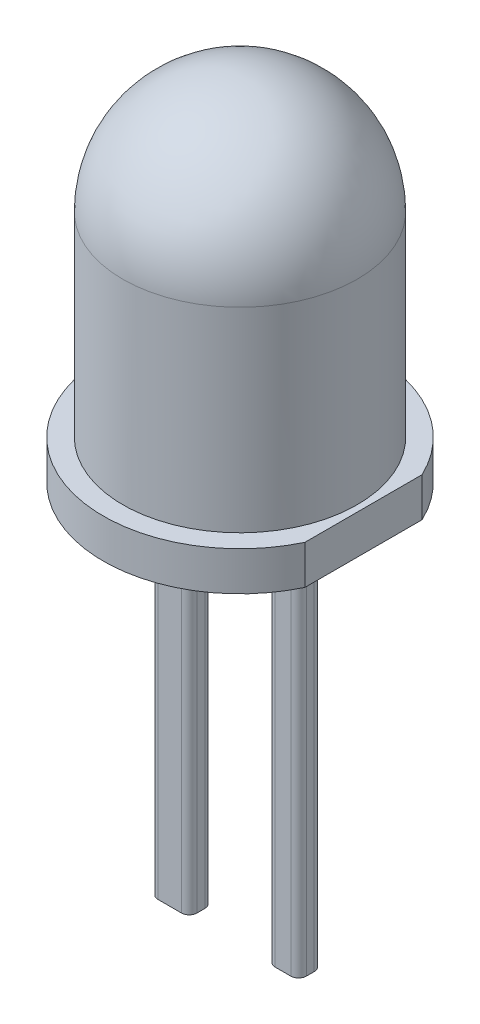
ISO-10303-21;
HEADER;
FILE_DESCRIPTION(('STEP AP214'),'2;1');
FILE_NAME('part.step','',(''),(''),'','','');
FILE_SCHEMA(('AUTOMOTIVE_DESIGN { 1 0 10303 214 1 1 1 1 }'));
ENDSEC;
DATA;
#1=APPLICATION_CONTEXT('core data for automotive mechanical design processes');
#2=APPLICATION_PROTOCOL_DEFINITION('international standard','automotive_design',2000,#1);
#3=PRODUCT_CONTEXT('',#1,'mechanical');
#4=PRODUCT('Part','Part','',(#3));
#5=PRODUCT_RELATED_PRODUCT_CATEGORY('part','',(#4));
#6=PRODUCT_DEFINITION_FORMATION('','',#4);
#7=PRODUCT_DEFINITION_CONTEXT('part definition',#1,'design');
#8=PRODUCT_DEFINITION('design','',#6,#7);
#9=PRODUCT_DEFINITION_SHAPE('','',#8);
#10=(LENGTH_UNIT() NAMED_UNIT(*) SI_UNIT(.MILLI.,.METRE.));
#11=(NAMED_UNIT(*) PLANE_ANGLE_UNIT() SI_UNIT($,.RADIAN.));
#12=(NAMED_UNIT(*) SI_UNIT($,.STERADIAN.) SOLID_ANGLE_UNIT());
#13=UNCERTAINTY_MEASURE_WITH_UNIT(LENGTH_MEASURE(1.E-05),#10,'distance_accuracy_value','');
#14=(GEOMETRIC_REPRESENTATION_CONTEXT(3) GLOBAL_UNCERTAINTY_ASSIGNED_CONTEXT((#13)) GLOBAL_UNIT_ASSIGNED_CONTEXT((#10,
#11,#12)) REPRESENTATION_CONTEXT('',''));
#15=CARTESIAN_POINT('',(0.,0.,0.));
#16=DIRECTION('',(0.,0.,1.));
#17=DIRECTION('',(1.,0.,0.));
#18=AXIS2_PLACEMENT_3D('',#15,#16,#17);
#19=CARTESIAN_POINT('',(0.,0.,0.));
#20=DIRECTION('',(0.,1.,0.));
#21=DIRECTION('',(0.,0.,1.));
#22=AXIS2_PLACEMENT_3D('',#19,#20,#21);
#23=PLANE('',#22);
#24=CARTESIAN_POINT('',(0.8,0.,0.05));
#25=DIRECTION('',(0.,-1.,0.));
#26=DIRECTION('',(0.,0.,1.));
#27=AXIS2_PLACEMENT_3D('',#24,#25,#26);
#28=CIRCLE('',#27,0.1);
#29=CARTESIAN_POINT('',(0.9,0.,0.0499999999999993));
#30=VERTEX_POINT('',#29);
#31=CARTESIAN_POINT('',(0.799999999999999,0.,0.15));
#32=VERTEX_POINT('',#31);
#33=EDGE_CURVE('E180',#30,#32,#28,.T.);
#34=ORIENTED_EDGE('',*,*,#33,.F.);
#35=DIRECTION('',(0.,0.,1.));
#36=VECTOR('',#35,1.);
#37=CARTESIAN_POINT('',(0.9,0.,0.0499999999999993));
#38=LINE('',#37,#36);
#39=CARTESIAN_POINT('',(0.9,0.,-0.0499999999999993));
#40=VERTEX_POINT('',#39);
#41=EDGE_CURVE('E193',#40,#30,#38,.T.);
#42=ORIENTED_EDGE('',*,*,#41,.F.);
#43=CARTESIAN_POINT('',(0.8,0.,-0.05));
#44=DIRECTION('',(0.,-1.,0.));
#45=DIRECTION('',(0.,0.,-1.));
#46=AXIS2_PLACEMENT_3D('',#43,#44,#45);
#47=CIRCLE('',#46,0.1);
#48=CARTESIAN_POINT('',(0.799999999999999,0.,-0.15));
#49=VERTEX_POINT('',#48);
#50=EDGE_CURVE('E222',#49,#40,#47,.T.);
#51=ORIENTED_EDGE('',*,*,#50,.F.);
#52=DIRECTION('',(1.,0.,0.));
#53=VECTOR('',#52,1.);
#54=CARTESIAN_POINT('',(0.600000000000001,0.,-0.15));
#55=LINE('',#54,#53);
#56=CARTESIAN_POINT('',(0.600000000000001,0.,-0.15));
#57=VERTEX_POINT('',#56);
#58=EDGE_CURVE('E219',#57,#49,#55,.T.);
#59=ORIENTED_EDGE('',*,*,#58,.F.);
#60=CARTESIAN_POINT('',(0.6,0.,-0.05));
#61=DIRECTION('',(0.,-1.,0.));
#62=DIRECTION('',(0.,0.,-1.));
#63=AXIS2_PLACEMENT_3D('',#60,#61,#62);
#64=CIRCLE('',#63,0.1);
#65=CARTESIAN_POINT('',(0.5,0.,-0.0499999999999993));
#66=VERTEX_POINT('',#65);
#67=EDGE_CURVE('E216',#66,#57,#64,.T.);
#68=ORIENTED_EDGE('',*,*,#67,.F.);
#69=DIRECTION('',(0.,0.,-1.));
#70=VECTOR('',#69,1.);
#71=CARTESIAN_POINT('',(0.5,0.,0.0499999999999993));
#72=LINE('',#71,#70);
#73=CARTESIAN_POINT('',(0.5,0.,0.0499999999999993));
#74=VERTEX_POINT('',#73);
#75=EDGE_CURVE('E213',#74,#66,#72,.T.);
#76=ORIENTED_EDGE('',*,*,#75,.F.);
#77=CARTESIAN_POINT('',(0.6,0.,0.05));
#78=DIRECTION('',(0.,-1.,0.));
#79=DIRECTION('',(0.,0.,-1.));
#80=AXIS2_PLACEMENT_3D('',#77,#78,#79);
#81=CIRCLE('',#80,0.1);
#82=CARTESIAN_POINT('',(0.6,0.,0.15));
#83=VERTEX_POINT('',#82);
#84=EDGE_CURVE('E210',#83,#74,#81,.T.);
#85=ORIENTED_EDGE('',*,*,#84,.F.);
#86=DIRECTION('',(-1.,0.,0.));
#87=VECTOR('',#86,1.);
#88=CARTESIAN_POINT('',(0.600000000000001,0.,0.15));
#89=LINE('',#88,#87);
#90=EDGE_CURVE('E183',#32,#83,#89,.T.);
#91=ORIENTED_EDGE('',*,*,#90,.F.);
#92=EDGE_LOOP('',(#34,#42,#51,#59,#68,#76,#85,#91));
#93=FACE_BOUND('',#92,.T.);
#94=CARTESIAN_POINT('',(0.,0.,0.));
#95=DIRECTION('',(0.,-1.,0.));
#96=DIRECTION('',(0.,0.,-1.));
#97=AXIS2_PLACEMENT_3D('',#94,#95,#96);
#98=CIRCLE('',#97,1.75);
#99=CARTESIAN_POINT('',(1.58113883008419,0.,0.75));
#100=VERTEX_POINT('',#99);
#101=CARTESIAN_POINT('',(1.58113883008419,0.,-0.75));
#102=VERTEX_POINT('',#101);
#103=EDGE_CURVE('E42',#100,#102,#98,.T.);
#104=ORIENTED_EDGE('',*,*,#103,.T.);
#105=DIRECTION('',(0.,0.,-1.));
#106=VECTOR('',#105,1.);
#107=CARTESIAN_POINT('',(1.58113883008419,0.,-0.75));
#108=LINE('',#107,#106);
#109=EDGE_CURVE('E250',#100,#102,#108,.T.);
#110=ORIENTED_EDGE('',*,*,#109,.F.);
#111=EDGE_LOOP('',(#104,#110));
#112=FACE_BOUND('',#111,.T.);
#113=CARTESIAN_POINT('',(-0.6,0.,-0.05));
#114=DIRECTION('',(0.,-1.,0.));
#115=DIRECTION('',(0.,0.,-1.));
#116=AXIS2_PLACEMENT_3D('',#113,#114,#115);
#117=CIRCLE('',#116,0.1);
#118=CARTESIAN_POINT('',(-0.600000000000001,0.,-0.15));
#119=VERTEX_POINT('',#118);
#120=CARTESIAN_POINT('',(-0.5,0.,-0.0499999999999993));
#121=VERTEX_POINT('',#120);
#122=EDGE_CURVE('E179',#119,#121,#117,.T.);
#123=ORIENTED_EDGE('',*,*,#122,.F.);
#124=DIRECTION('',(1.,0.,0.));
#125=VECTOR('',#124,1.);
#126=CARTESIAN_POINT('',(-0.899999999999999,0.,-0.15));
#127=LINE('',#126,#125);
#128=CARTESIAN_POINT('',(-0.899999999999999,0.,-0.15));
#129=VERTEX_POINT('',#128);
#130=EDGE_CURVE('E176',#129,#119,#127,.T.);
#131=ORIENTED_EDGE('',*,*,#130,.F.);
#132=CARTESIAN_POINT('',(-0.9,0.,-0.05));
#133=DIRECTION('',(0.,-1.,0.));
#134=DIRECTION('',(0.,0.,-1.));
#135=AXIS2_PLACEMENT_3D('',#132,#133,#134);
#136=CIRCLE('',#135,0.1);
#137=CARTESIAN_POINT('',(-1.,0.,-0.0499999999999993));
#138=VERTEX_POINT('',#137);
#139=EDGE_CURVE('E529',#138,#129,#136,.T.);
#140=ORIENTED_EDGE('',*,*,#139,.F.);
#141=DIRECTION('',(0.,0.,-1.));
#142=VECTOR('',#141,1.);
#143=CARTESIAN_POINT('',(-1.,0.,0.0499999999999993));
#144=LINE('',#143,#142);
#145=CARTESIAN_POINT('',(-1.,0.,0.0499999999999993));
#146=VERTEX_POINT('',#145);
#147=EDGE_CURVE('E560',#146,#138,#144,.T.);
#148=ORIENTED_EDGE('',*,*,#147,.F.);
#149=CARTESIAN_POINT('',(-0.9,0.,0.05));
#150=DIRECTION('',(0.,-1.,0.));
#151=DIRECTION('',(0.,0.,-1.));
#152=AXIS2_PLACEMENT_3D('',#149,#150,#151);
#153=CIRCLE('',#152,0.1);
#154=CARTESIAN_POINT('',(-0.9,0.,0.15));
#155=VERTEX_POINT('',#154);
#156=EDGE_CURVE('E553',#155,#146,#153,.T.);
#157=ORIENTED_EDGE('',*,*,#156,.F.);
#158=DIRECTION('',(-1.,0.,0.));
#159=VECTOR('',#158,1.);
#160=CARTESIAN_POINT('',(-0.899999999999999,0.,0.15));
#161=LINE('',#160,#159);
#162=CARTESIAN_POINT('',(-0.600000000000001,0.,0.15));
#163=VERTEX_POINT('',#162);
#164=EDGE_CURVE('E550',#163,#155,#161,.T.);
#165=ORIENTED_EDGE('',*,*,#164,.F.);
#166=CARTESIAN_POINT('',(-0.6,0.,0.05));
#167=DIRECTION('',(0.,-1.,0.));
#168=DIRECTION('',(0.,0.,1.));
#169=AXIS2_PLACEMENT_3D('',#166,#167,#168);
#170=CIRCLE('',#169,0.1);
#171=CARTESIAN_POINT('',(-0.5,0.,0.0499999999999993));
#172=VERTEX_POINT('',#171);
#173=EDGE_CURVE('E54',#172,#163,#170,.T.);
#174=ORIENTED_EDGE('',*,*,#173,.F.);
#175=DIRECTION('',(0.,0.,1.));
#176=VECTOR('',#175,1.);
#177=CARTESIAN_POINT('',(-0.5,0.,0.0499999999999993));
#178=LINE('',#177,#176);
#179=EDGE_CURVE('E49',#121,#172,#178,.T.);
#180=ORIENTED_EDGE('',*,*,#179,.F.);
#181=EDGE_LOOP('',(#123,#131,#140,#148,#157,#165,#174,#180));
#182=FACE_BOUND('',#181,.T.);
#183=ADVANCED_FACE('F35',(#93,#112,#182),#23,.F.);
#184=CARTESIAN_POINT('',(0.,0.,0.));
#185=DIRECTION('',(0.,-1.,0.));
#186=DIRECTION('',(0.,0.,-1.));
#187=AXIS2_PLACEMENT_3D('',#184,#185,#186);
#188=CYLINDRICAL_SURFACE('',#187,1.75);
#189=CARTESIAN_POINT('',(0.,0.5,0.));
#190=DIRECTION('',(0.,-1.,0.));
#191=DIRECTION('',(0.,0.,-1.));
#192=AXIS2_PLACEMENT_3D('',#189,#190,#191);
#193=CIRCLE('',#192,1.75);
#194=CARTESIAN_POINT('',(1.58113883008419,0.5,0.75));
#195=VERTEX_POINT('',#194);
#196=CARTESIAN_POINT('',(1.58113883008419,0.5,-0.75));
#197=VERTEX_POINT('',#196);
#198=EDGE_CURVE('E263',#195,#197,#193,.T.);
#199=ORIENTED_EDGE('',*,*,#198,.T.);
#200=DIRECTION('',(0.,-1.,0.));
#201=VECTOR('',#200,1.);
#202=CARTESIAN_POINT('',(1.58113883008419,1.,-0.75));
#203=LINE('',#202,#201);
#204=EDGE_CURVE('E253',#197,#102,#203,.T.);
#205=ORIENTED_EDGE('',*,*,#204,.T.);
#206=ORIENTED_EDGE('',*,*,#103,.F.);
#207=DIRECTION('',(0.,-1.,0.));
#208=VECTOR('',#207,1.);
#209=CARTESIAN_POINT('',(1.58113883008419,1.,0.75));
#210=LINE('',#209,#208);
#211=EDGE_CURVE('E252',#195,#100,#210,.T.);
#212=ORIENTED_EDGE('',*,*,#211,.F.);
#213=EDGE_LOOP('',(#199,#205,#206,#212));
#214=FACE_BOUND('',#213,.T.);
#215=ADVANCED_FACE('F271',(#214),#188,.T.);
#216=CARTESIAN_POINT('',(-1.75,0.5,0.));
#217=DIRECTION('',(0.,-1.,0.));
#218=DIRECTION('',(0.,0.,-1.));
#219=AXIS2_PLACEMENT_3D('',#216,#217,#218);
#220=PLANE('',#219);
#221=ORIENTED_EDGE('',*,*,#198,.F.);
#222=DIRECTION('',(0.,0.,-1.));
#223=VECTOR('',#222,1.);
#224=CARTESIAN_POINT('',(1.58113883008419,0.5,0.));
#225=LINE('',#224,#223);
#226=EDGE_CURVE('E11',#195,#197,#225,.T.);
#227=ORIENTED_EDGE('',*,*,#226,.T.);
#228=EDGE_LOOP('',(#221,#227));
#229=FACE_BOUND('',#228,.T.);
#230=CARTESIAN_POINT('',(0.,0.5,0.));
#231=DIRECTION('',(0.,-1.,0.));
#232=DIRECTION('',(0.,0.,-1.));
#233=AXIS2_PLACEMENT_3D('',#230,#231,#232);
#234=CIRCLE('',#233,1.5);
#235=CARTESIAN_POINT('',(0.,0.5,-1.5));
#236=VERTEX_POINT('',#235);
#237=EDGE_CURVE('E260',#236,#236,#234,.T.);
#238=ORIENTED_EDGE('',*,*,#237,.T.);
#239=EDGE_LOOP('',(#238));
#240=FACE_BOUND('',#239,.T.);
#241=ADVANCED_FACE('F276',(#229,#240),#220,.F.);
#242=CARTESIAN_POINT('',(0.,0.,0.));
#243=DIRECTION('',(0.,-1.,0.));
#244=DIRECTION('',(0.,0.,-1.));
#245=AXIS2_PLACEMENT_3D('',#242,#243,#244);
#246=CYLINDRICAL_SURFACE('',#245,1.5);
#247=ORIENTED_EDGE('',*,*,#237,.F.);
#248=EDGE_LOOP('',(#247));
#249=FACE_BOUND('',#248,.T.);
#250=CARTESIAN_POINT('',(0.,3.00000000000001,0.));
#251=DIRECTION('',(0.,-1.,0.));
#252=DIRECTION('',(0.,0.,-1.));
#253=AXIS2_PLACEMENT_3D('',#250,#251,#252);
#254=CIRCLE('',#253,1.5);
#255=CARTESIAN_POINT('',(0.,3.00000000000001,-1.5));
#256=VERTEX_POINT('',#255);
#257=EDGE_CURVE('E256',#256,#256,#254,.T.);
#258=ORIENTED_EDGE('',*,*,#257,.T.);
#259=EDGE_LOOP('',(#258));
#260=FACE_BOUND('',#259,.T.);
#261=ADVANCED_FACE('F279',(#249,#260),#246,.T.);
#262=CARTESIAN_POINT('',(0.,3.00000000000001,0.));
#263=DIRECTION('',(0.,-1.,0.));
#264=DIRECTION('',(1.,0.,0.));
#265=AXIS2_PLACEMENT_3D('',#262,#263,#264);
#266=SPHERICAL_SURFACE('',#265,1.49999999999999);
#267=ORIENTED_EDGE('',*,*,#257,.F.);
#268=EDGE_LOOP('',(#267));
#269=FACE_BOUND('',#268,.T.);
#270=ADVANCED_FACE('F285',(#269),#266,.T.);
#271=CARTESIAN_POINT('',(1.58113883008419,1.,-0.75));
#272=DIRECTION('',(-1.,0.,0.));
#273=DIRECTION('',(0.,0.,1.));
#274=AXIS2_PLACEMENT_3D('',#271,#272,#273);
#275=PLANE('',#274);
#276=ORIENTED_EDGE('',*,*,#211,.T.);
#277=ORIENTED_EDGE('',*,*,#109,.T.);
#278=ORIENTED_EDGE('',*,*,#204,.F.);
#279=ORIENTED_EDGE('',*,*,#226,.F.);
#280=EDGE_LOOP('',(#276,#277,#278,#279));
#281=FACE_BOUND('',#280,.T.);
#282=ADVANCED_FACE('F274',(#281),#275,.F.);
#283=CARTESIAN_POINT('',(0.8,-5.,0.05));
#284=DIRECTION('',(0.,1.,0.));
#285=DIRECTION('',(0.,0.,1.));
#286=AXIS2_PLACEMENT_3D('',#283,#284,#285);
#287=CYLINDRICAL_SURFACE('',#286,0.1);
#288=ORIENTED_EDGE('',*,*,#33,.T.);
#289=DIRECTION('',(0.,1.,0.));
#290=VECTOR('',#289,1.);
#291=CARTESIAN_POINT('',(0.799999999999999,-5.,0.15));
#292=LINE('',#291,#290);
#293=CARTESIAN_POINT('',(0.799999999999999,-5.,0.15));
#294=VERTEX_POINT('',#293);
#295=EDGE_CURVE('E247',#294,#32,#292,.T.);
#296=ORIENTED_EDGE('',*,*,#295,.F.);
#297=CARTESIAN_POINT('',(0.8,-5.,0.05));
#298=DIRECTION('',(0.,-1.,0.));
#299=DIRECTION('',(0.,0.,1.));
#300=AXIS2_PLACEMENT_3D('',#297,#298,#299);
#301=CIRCLE('',#300,0.1);
#302=CARTESIAN_POINT('',(0.9,-5.,0.0499999999999993));
#303=VERTEX_POINT('',#302);
#304=EDGE_CURVE('E189',#303,#294,#301,.T.);
#305=ORIENTED_EDGE('',*,*,#304,.F.);
#306=DIRECTION('',(0.,1.,0.));
#307=VECTOR('',#306,1.);
#308=CARTESIAN_POINT('',(0.9,-5.,0.0499999999999993));
#309=LINE('',#308,#307);
#310=EDGE_CURVE('E206',#303,#30,#309,.T.);
#311=ORIENTED_EDGE('',*,*,#310,.T.);
#312=EDGE_LOOP('',(#288,#296,#305,#311));
#313=FACE_BOUND('',#312,.T.);
#314=ADVANCED_FACE('F294',(#313),#287,.T.);
#315=CARTESIAN_POINT('',(0.600000000000001,-5.,0.15));
#316=DIRECTION('',(0.,0.,-1.));
#317=DIRECTION('',(-1.,0.,0.));
#318=AXIS2_PLACEMENT_3D('',#315,#316,#317);
#319=PLANE('',#318);
#320=ORIENTED_EDGE('',*,*,#90,.T.);
#321=DIRECTION('',(0.,1.,0.));
#322=VECTOR('',#321,1.);
#323=CARTESIAN_POINT('',(0.600000000000001,-5.,0.15));
#324=LINE('',#323,#322);
#325=CARTESIAN_POINT('',(0.600000000000001,-5.,0.15));
#326=VERTEX_POINT('',#325);
#327=EDGE_CURVE('E244',#326,#83,#324,.T.);
#328=ORIENTED_EDGE('',*,*,#327,.F.);
#329=DIRECTION('',(-1.,0.,0.));
#330=VECTOR('',#329,1.);
#331=CARTESIAN_POINT('',(0.600000000000001,-5.,0.15));
#332=LINE('',#331,#330);
#333=EDGE_CURVE('E192',#294,#326,#332,.T.);
#334=ORIENTED_EDGE('',*,*,#333,.F.);
#335=ORIENTED_EDGE('',*,*,#295,.T.);
#336=EDGE_LOOP('',(#320,#328,#334,#335));
#337=FACE_BOUND('',#336,.T.);
#338=ADVANCED_FACE('F332',(#337),#319,.F.);
#339=CARTESIAN_POINT('',(0.6,-5.,0.05));
#340=DIRECTION('',(0.,1.,0.));
#341=DIRECTION('',(0.,0.,1.));
#342=AXIS2_PLACEMENT_3D('',#339,#340,#341);
#343=CYLINDRICAL_SURFACE('',#342,0.1);
#344=ORIENTED_EDGE('',*,*,#84,.T.);
#345=DIRECTION('',(0.,1.,0.));
#346=VECTOR('',#345,1.);
#347=CARTESIAN_POINT('',(0.5,-5.,0.0499999999999993));
#348=LINE('',#347,#346);
#349=CARTESIAN_POINT('',(0.5,-5.,0.0499999999999993));
#350=VERTEX_POINT('',#349);
#351=EDGE_CURVE('E241',#350,#74,#348,.T.);
#352=ORIENTED_EDGE('',*,*,#351,.F.);
#353=CARTESIAN_POINT('',(0.6,-5.,0.05));
#354=DIRECTION('',(0.,-1.,0.));
#355=DIRECTION('',(0.,0.,-1.));
#356=AXIS2_PLACEMENT_3D('',#353,#354,#355);
#357=CIRCLE('',#356,0.1);
#358=EDGE_CURVE('E195',#326,#350,#357,.T.);
#359=ORIENTED_EDGE('',*,*,#358,.F.);
#360=ORIENTED_EDGE('',*,*,#327,.T.);
#361=EDGE_LOOP('',(#344,#352,#359,#360));
#362=FACE_BOUND('',#361,.T.);
#363=ADVANCED_FACE('F330',(#362),#343,.T.);
#364=CARTESIAN_POINT('',(0.5,-5.,0.0499999999999993));
#365=DIRECTION('',(1.,0.,0.));
#366=DIRECTION('',(0.,0.,-1.));
#367=AXIS2_PLACEMENT_3D('',#364,#365,#366);
#368=PLANE('',#367);
#369=ORIENTED_EDGE('',*,*,#75,.T.);
#370=DIRECTION('',(0.,1.,0.));
#371=VECTOR('',#370,1.);
#372=CARTESIAN_POINT('',(0.5,-5.,-0.0499999999999993));
#373=LINE('',#372,#371);
#374=CARTESIAN_POINT('',(0.5,-5.,-0.0499999999999993));
#375=VERTEX_POINT('',#374);
#376=EDGE_CURVE('E238',#375,#66,#373,.T.);
#377=ORIENTED_EDGE('',*,*,#376,.F.);
#378=DIRECTION('',(0.,0.,-1.));
#379=VECTOR('',#378,1.);
#380=CARTESIAN_POINT('',(0.5,-5.,0.0499999999999993));
#381=LINE('',#380,#379);
#382=EDGE_CURVE('E197',#350,#375,#381,.T.);
#383=ORIENTED_EDGE('',*,*,#382,.F.);
#384=ORIENTED_EDGE('',*,*,#351,.T.);
#385=EDGE_LOOP('',(#369,#377,#383,#384));
#386=FACE_BOUND('',#385,.T.);
#387=ADVANCED_FACE('F325',(#386),#368,.F.);
#388=CARTESIAN_POINT('',(0.6,-5.,-0.05));
#389=DIRECTION('',(0.,1.,0.));
#390=DIRECTION('',(0.,0.,1.));
#391=AXIS2_PLACEMENT_3D('',#388,#389,#390);
#392=CYLINDRICAL_SURFACE('',#391,0.1);
#393=ORIENTED_EDGE('',*,*,#67,.T.);
#394=DIRECTION('',(0.,1.,0.));
#395=VECTOR('',#394,1.);
#396=CARTESIAN_POINT('',(0.600000000000001,-5.,-0.15));
#397=LINE('',#396,#395);
#398=CARTESIAN_POINT('',(0.600000000000001,-5.,-0.15));
#399=VERTEX_POINT('',#398);
#400=EDGE_CURVE('E235',#399,#57,#397,.T.);
#401=ORIENTED_EDGE('',*,*,#400,.F.);
#402=CARTESIAN_POINT('',(0.6,-5.,-0.05));
#403=DIRECTION('',(0.,-1.,0.));
#404=DIRECTION('',(0.,0.,-1.));
#405=AXIS2_PLACEMENT_3D('',#402,#403,#404);
#406=CIRCLE('',#405,0.1);
#407=EDGE_CURVE('E199',#375,#399,#406,.T.);
#408=ORIENTED_EDGE('',*,*,#407,.F.);
#409=ORIENTED_EDGE('',*,*,#376,.T.);
#410=EDGE_LOOP('',(#393,#401,#408,#409));
#411=FACE_BOUND('',#410,.T.);
#412=ADVANCED_FACE('F322',(#411),#392,.T.);
#413=CARTESIAN_POINT('',(0.600000000000001,-5.,-0.15));
#414=DIRECTION('',(0.,0.,1.));
#415=DIRECTION('',(1.,0.,0.));
#416=AXIS2_PLACEMENT_3D('',#413,#414,#415);
#417=PLANE('',#416);
#418=ORIENTED_EDGE('',*,*,#58,.T.);
#419=DIRECTION('',(0.,1.,0.));
#420=VECTOR('',#419,1.);
#421=CARTESIAN_POINT('',(0.799999999999999,-5.,-0.15));
#422=LINE('',#421,#420);
#423=CARTESIAN_POINT('',(0.799999999999999,-5.,-0.15));
#424=VERTEX_POINT('',#423);
#425=EDGE_CURVE('E232',#424,#49,#422,.T.);
#426=ORIENTED_EDGE('',*,*,#425,.F.);
#427=DIRECTION('',(1.,0.,0.));
#428=VECTOR('',#427,1.);
#429=CARTESIAN_POINT('',(0.600000000000001,-5.,-0.15));
#430=LINE('',#429,#428);
#431=EDGE_CURVE('E201',#399,#424,#430,.T.);
#432=ORIENTED_EDGE('',*,*,#431,.F.);
#433=ORIENTED_EDGE('',*,*,#400,.T.);
#434=EDGE_LOOP('',(#418,#426,#432,#433));
#435=FACE_BOUND('',#434,.T.);
#436=ADVANCED_FACE('F318',(#435),#417,.F.);
#437=CARTESIAN_POINT('',(0.8,-5.,-0.05));
#438=DIRECTION('',(0.,1.,0.));
#439=DIRECTION('',(0.,0.,1.));
#440=AXIS2_PLACEMENT_3D('',#437,#438,#439);
#441=CYLINDRICAL_SURFACE('',#440,0.1);
#442=ORIENTED_EDGE('',*,*,#50,.T.);
#443=DIRECTION('',(0.,1.,0.));
#444=VECTOR('',#443,1.);
#445=CARTESIAN_POINT('',(0.9,-5.,-0.0499999999999993));
#446=LINE('',#445,#444);
#447=CARTESIAN_POINT('',(0.9,-5.,-0.0499999999999993));
#448=VERTEX_POINT('',#447);
#449=EDGE_CURVE('E229',#448,#40,#446,.T.);
#450=ORIENTED_EDGE('',*,*,#449,.F.);
#451=CARTESIAN_POINT('',(0.8,-5.,-0.05));
#452=DIRECTION('',(0.,-1.,0.));
#453=DIRECTION('',(0.,0.,-1.));
#454=AXIS2_PLACEMENT_3D('',#451,#452,#453);
#455=CIRCLE('',#454,0.1);
#456=EDGE_CURVE('E203',#424,#448,#455,.T.);
#457=ORIENTED_EDGE('',*,*,#456,.F.);
#458=ORIENTED_EDGE('',*,*,#425,.T.);
#459=EDGE_LOOP('',(#442,#450,#457,#458));
#460=FACE_BOUND('',#459,.T.);
#461=ADVANCED_FACE('F316',(#460),#441,.T.);
#462=CARTESIAN_POINT('',(0.9,-5.,0.0499999999999993));
#463=DIRECTION('',(-1.,0.,0.));
#464=DIRECTION('',(0.,0.,1.));
#465=AXIS2_PLACEMENT_3D('',#462,#463,#464);
#466=PLANE('',#465);
#467=ORIENTED_EDGE('',*,*,#41,.T.);
#468=ORIENTED_EDGE('',*,*,#310,.F.);
#469=DIRECTION('',(0.,0.,1.));
#470=VECTOR('',#469,1.);
#471=CARTESIAN_POINT('',(0.9,-5.,0.0499999999999993));
#472=LINE('',#471,#470);
#473=EDGE_CURVE('E205',#448,#303,#472,.T.);
#474=ORIENTED_EDGE('',*,*,#473,.F.);
#475=ORIENTED_EDGE('',*,*,#449,.T.);
#476=EDGE_LOOP('',(#467,#468,#474,#475));
#477=FACE_BOUND('',#476,.T.);
#478=ADVANCED_FACE('F305',(#477),#466,.F.);
#479=CARTESIAN_POINT('',(0.8,-5.,0.05));
#480=DIRECTION('',(0.,1.,0.));
#481=DIRECTION('',(0.,0.,1.));
#482=AXIS2_PLACEMENT_3D('',#479,#480,#481);
#483=PLANE('',#482);
#484=ORIENTED_EDGE('',*,*,#304,.T.);
#485=ORIENTED_EDGE('',*,*,#333,.T.);
#486=ORIENTED_EDGE('',*,*,#358,.T.);
#487=ORIENTED_EDGE('',*,*,#382,.T.);
#488=ORIENTED_EDGE('',*,*,#407,.T.);
#489=ORIENTED_EDGE('',*,*,#431,.T.);
#490=ORIENTED_EDGE('',*,*,#456,.T.);
#491=ORIENTED_EDGE('',*,*,#473,.T.);
#492=EDGE_LOOP('',(#484,#485,#486,#487,#488,#489,#490,#491));
#493=FACE_BOUND('',#492,.T.);
#494=ADVANCED_FACE('F310',(#493),#483,.F.);
#495=CARTESIAN_POINT('',(-0.6,-5.,-0.05));
#496=DIRECTION('',(0.,1.,0.));
#497=DIRECTION('',(0.,0.,1.));
#498=AXIS2_PLACEMENT_3D('',#495,#496,#497);
#499=CYLINDRICAL_SURFACE('',#498,0.1);
#500=ORIENTED_EDGE('',*,*,#122,.T.);
#501=DIRECTION('',(0.,1.,0.));
#502=VECTOR('',#501,1.);
#503=CARTESIAN_POINT('',(-0.5,-5.,-0.0499999999999993));
#504=LINE('',#503,#502);
#505=CARTESIAN_POINT('',(-0.5,-5.,-0.0499999999999993));
#506=VERTEX_POINT('',#505);
#507=EDGE_CURVE('E160',#506,#121,#504,.T.);
#508=ORIENTED_EDGE('',*,*,#507,.F.);
#509=CARTESIAN_POINT('',(-0.6,-5.,-0.05));
#510=DIRECTION('',(0.,-1.,0.));
#511=DIRECTION('',(0.,0.,-1.));
#512=AXIS2_PLACEMENT_3D('',#509,#510,#511);
#513=CIRCLE('',#512,0.1);
#514=CARTESIAN_POINT('',(-0.600000000000001,-5.,-0.15));
#515=VERTEX_POINT('',#514);
#516=EDGE_CURVE('E167',#515,#506,#513,.T.);
#517=ORIENTED_EDGE('',*,*,#516,.F.);
#518=DIRECTION('',(0.,1.,0.));
#519=VECTOR('',#518,1.);
#520=CARTESIAN_POINT('',(-0.600000000000001,-5.,-0.15));
#521=LINE('',#520,#519);
#522=EDGE_CURVE('E525',#515,#119,#521,.T.);
#523=ORIENTED_EDGE('',*,*,#522,.T.);
#524=EDGE_LOOP('',(#500,#508,#517,#523));
#525=FACE_BOUND('',#524,.T.);
#526=ADVANCED_FACE('F178',(#525),#499,.T.);
#527=CARTESIAN_POINT('',(-0.5,-5.,0.0499999999999993));
#528=DIRECTION('',(-1.,0.,0.));
#529=DIRECTION('',(0.,0.,1.));
#530=AXIS2_PLACEMENT_3D('',#527,#528,#529);
#531=PLANE('',#530);
#532=ORIENTED_EDGE('',*,*,#179,.T.);
#533=DIRECTION('',(0.,1.,0.));
#534=VECTOR('',#533,1.);
#535=CARTESIAN_POINT('',(-0.5,-5.,0.0499999999999993));
#536=LINE('',#535,#534);
#537=CARTESIAN_POINT('',(-0.5,-5.,0.0499999999999993));
#538=VERTEX_POINT('',#537);
#539=EDGE_CURVE('E163',#538,#172,#536,.T.);
#540=ORIENTED_EDGE('',*,*,#539,.F.);
#541=DIRECTION('',(0.,0.,1.));
#542=VECTOR('',#541,1.);
#543=CARTESIAN_POINT('',(-0.5,-5.,0.0499999999999993));
#544=LINE('',#543,#542);
#545=EDGE_CURVE('E156',#506,#538,#544,.T.);
#546=ORIENTED_EDGE('',*,*,#545,.F.);
#547=ORIENTED_EDGE('',*,*,#507,.T.);
#548=EDGE_LOOP('',(#532,#540,#546,#547));
#549=FACE_BOUND('',#548,.T.);
#550=ADVANCED_FACE('F158',(#549),#531,.F.);
#551=CARTESIAN_POINT('',(-0.6,-5.,0.05));
#552=DIRECTION('',(0.,1.,0.));
#553=DIRECTION('',(0.,0.,1.));
#554=AXIS2_PLACEMENT_3D('',#551,#552,#553);
#555=CYLINDRICAL_SURFACE('',#554,0.1);
#556=ORIENTED_EDGE('',*,*,#173,.T.);
#557=DIRECTION('',(0.,1.,0.));
#558=VECTOR('',#557,1.);
#559=CARTESIAN_POINT('',(-0.600000000000001,-5.,0.15));
#560=LINE('',#559,#558);
#561=CARTESIAN_POINT('',(-0.600000000000001,-5.,0.15));
#562=VERTEX_POINT('',#561);
#563=EDGE_CURVE('E185',#562,#163,#560,.T.);
#564=ORIENTED_EDGE('',*,*,#563,.F.);
#565=CARTESIAN_POINT('',(-0.6,-5.,0.05));
#566=DIRECTION('',(0.,-1.,0.));
#567=DIRECTION('',(0.,0.,1.));
#568=AXIS2_PLACEMENT_3D('',#565,#566,#567);
#569=CIRCLE('',#568,0.1);
#570=EDGE_CURVE('E166',#538,#562,#569,.T.);
#571=ORIENTED_EDGE('',*,*,#570,.F.);
#572=ORIENTED_EDGE('',*,*,#539,.T.);
#573=EDGE_LOOP('',(#556,#564,#571,#572));
#574=FACE_BOUND('',#573,.T.);
#575=ADVANCED_FACE('F358',(#574),#555,.T.);
#576=CARTESIAN_POINT('',(-0.899999999999999,-5.,0.15));
#577=DIRECTION('',(0.,0.,-1.));
#578=DIRECTION('',(-1.,0.,0.));
#579=AXIS2_PLACEMENT_3D('',#576,#577,#578);
#580=PLANE('',#579);
#581=ORIENTED_EDGE('',*,*,#164,.T.);
#582=DIRECTION('',(0.,1.,0.));
#583=VECTOR('',#582,1.);
#584=CARTESIAN_POINT('',(-0.899999999999999,-5.,0.15));
#585=LINE('',#584,#583);
#586=CARTESIAN_POINT('',(-0.899999999999999,-5.,0.15));
#587=VERTEX_POINT('',#586);
#588=EDGE_CURVE('E543',#587,#155,#585,.T.);
#589=ORIENTED_EDGE('',*,*,#588,.F.);
#590=DIRECTION('',(-1.,0.,0.));
#591=VECTOR('',#590,1.);
#592=CARTESIAN_POINT('',(-0.899999999999999,-5.,0.15));
#593=LINE('',#592,#591);
#594=EDGE_CURVE('E551',#562,#587,#593,.T.);
#595=ORIENTED_EDGE('',*,*,#594,.F.);
#596=ORIENTED_EDGE('',*,*,#563,.T.);
#597=EDGE_LOOP('',(#581,#589,#595,#596));
#598=FACE_BOUND('',#597,.T.);
#599=ADVANCED_FACE('F361',(#598),#580,.F.);
#600=CARTESIAN_POINT('',(-0.9,-5.,0.05));
#601=DIRECTION('',(0.,1.,0.));
#602=DIRECTION('',(0.,0.,1.));
#603=AXIS2_PLACEMENT_3D('',#600,#601,#602);
#604=CYLINDRICAL_SURFACE('',#603,0.1);
#605=ORIENTED_EDGE('',*,*,#156,.T.);
#606=DIRECTION('',(0.,1.,0.));
#607=VECTOR('',#606,1.);
#608=CARTESIAN_POINT('',(-1.,-5.,0.0499999999999993));
#609=LINE('',#608,#607);
#610=CARTESIAN_POINT('',(-1.,-5.,0.0499999999999993));
#611=VERTEX_POINT('',#610);
#612=EDGE_CURVE('E540',#611,#146,#609,.T.);
#613=ORIENTED_EDGE('',*,*,#612,.F.);
#614=CARTESIAN_POINT('',(-0.9,-5.,0.05));
#615=DIRECTION('',(0.,-1.,0.));
#616=DIRECTION('',(0.,0.,-1.));
#617=AXIS2_PLACEMENT_3D('',#614,#615,#616);
#618=CIRCLE('',#617,0.1);
#619=EDGE_CURVE('E568',#587,#611,#618,.T.);
#620=ORIENTED_EDGE('',*,*,#619,.F.);
#621=ORIENTED_EDGE('',*,*,#588,.T.);
#622=EDGE_LOOP('',(#605,#613,#620,#621));
#623=FACE_BOUND('',#622,.T.);
#624=ADVANCED_FACE('F365',(#623),#604,.T.);
#625=CARTESIAN_POINT('',(-1.,-5.,0.0499999999999993));
#626=DIRECTION('',(1.,0.,0.));
#627=DIRECTION('',(0.,0.,-1.));
#628=AXIS2_PLACEMENT_3D('',#625,#626,#627);
#629=PLANE('',#628);
#630=ORIENTED_EDGE('',*,*,#147,.T.);
#631=DIRECTION('',(0.,1.,0.));
#632=VECTOR('',#631,1.);
#633=CARTESIAN_POINT('',(-1.,-5.,-0.0499999999999993));
#634=LINE('',#633,#632);
#635=CARTESIAN_POINT('',(-1.,-5.,-0.0499999999999993));
#636=VERTEX_POINT('',#635);
#637=EDGE_CURVE('E532',#636,#138,#634,.T.);
#638=ORIENTED_EDGE('',*,*,#637,.F.);
#639=DIRECTION('',(0.,0.,-1.));
#640=VECTOR('',#639,1.);
#641=CARTESIAN_POINT('',(-1.,-5.,0.0499999999999993));
#642=LINE('',#641,#640);
#643=EDGE_CURVE('E566',#611,#636,#642,.T.);
#644=ORIENTED_EDGE('',*,*,#643,.F.);
#645=ORIENTED_EDGE('',*,*,#612,.T.);
#646=EDGE_LOOP('',(#630,#638,#644,#645));
#647=FACE_BOUND('',#646,.T.);
#648=ADVANCED_FACE('F369',(#647),#629,.F.);
#649=CARTESIAN_POINT('',(-0.9,-5.,-0.05));
#650=DIRECTION('',(0.,1.,0.));
#651=DIRECTION('',(0.,0.,1.));
#652=AXIS2_PLACEMENT_3D('',#649,#650,#651);
#653=CYLINDRICAL_SURFACE('',#652,0.1);
#654=ORIENTED_EDGE('',*,*,#139,.T.);
#655=DIRECTION('',(0.,1.,0.));
#656=VECTOR('',#655,1.);
#657=CARTESIAN_POINT('',(-0.899999999999999,-5.,-0.15));
#658=LINE('',#657,#656);
#659=CARTESIAN_POINT('',(-0.899999999999999,-5.,-0.15));
#660=VERTEX_POINT('',#659);
#661=EDGE_CURVE('E527',#660,#129,#658,.T.);
#662=ORIENTED_EDGE('',*,*,#661,.F.);
#663=CARTESIAN_POINT('',(-0.9,-5.,-0.05));
#664=DIRECTION('',(0.,-1.,0.));
#665=DIRECTION('',(0.,0.,-1.));
#666=AXIS2_PLACEMENT_3D('',#663,#664,#665);
#667=CIRCLE('',#666,0.1);
#668=EDGE_CURVE('E534',#636,#660,#667,.T.);
#669=ORIENTED_EDGE('',*,*,#668,.F.);
#670=ORIENTED_EDGE('',*,*,#637,.T.);
#671=EDGE_LOOP('',(#654,#662,#669,#670));
#672=FACE_BOUND('',#671,.T.);
#673=ADVANCED_FACE('F373',(#672),#653,.T.);
#674=CARTESIAN_POINT('',(-0.899999999999999,-5.,-0.15));
#675=DIRECTION('',(0.,0.,1.));
#676=DIRECTION('',(1.,0.,0.));
#677=AXIS2_PLACEMENT_3D('',#674,#675,#676);
#678=PLANE('',#677);
#679=ORIENTED_EDGE('',*,*,#130,.T.);
#680=ORIENTED_EDGE('',*,*,#522,.F.);
#681=DIRECTION('',(1.,0.,0.));
#682=VECTOR('',#681,1.);
#683=CARTESIAN_POINT('',(-0.899999999999999,-5.,-0.15));
#684=LINE('',#683,#682);
#685=EDGE_CURVE('E172',#660,#515,#684,.T.);
#686=ORIENTED_EDGE('',*,*,#685,.F.);
#687=ORIENTED_EDGE('',*,*,#661,.T.);
#688=EDGE_LOOP('',(#679,#680,#686,#687));
#689=FACE_BOUND('',#688,.T.);
#690=ADVANCED_FACE('F377',(#689),#678,.F.);
#691=CARTESIAN_POINT('',(-0.6,-5.,-0.05));
#692=DIRECTION('',(0.,-1.,0.));
#693=DIRECTION('',(0.,0.,-1.));
#694=AXIS2_PLACEMENT_3D('',#691,#692,#693);
#695=PLANE('',#694);
#696=ORIENTED_EDGE('',*,*,#516,.T.);
#697=ORIENTED_EDGE('',*,*,#545,.T.);
#698=ORIENTED_EDGE('',*,*,#570,.T.);
#699=ORIENTED_EDGE('',*,*,#594,.T.);
#700=ORIENTED_EDGE('',*,*,#619,.T.);
#701=ORIENTED_EDGE('',*,*,#643,.T.);
#702=ORIENTED_EDGE('',*,*,#668,.T.);
#703=ORIENTED_EDGE('',*,*,#685,.T.);
#704=EDGE_LOOP('',(#696,#697,#698,#699,#700,#701,#702,#703));
#705=FACE_BOUND('',#704,.T.);
#706=ADVANCED_FACE('F170',(#705),#695,.T.);
#707=CLOSED_SHELL('',(#183,#215,#241,#261,#270,#282,#314,#338,#363,#387,#412,#436,#461,#478,
#494,#526,#550,#575,#599,#624,#648,#673,#690,#706));
#708=MANIFOLD_SOLID_BREP('B2',#707);
#709=ADVANCED_BREP_SHAPE_REPRESENTATION('',(#18,#708),#14);
#710=SHAPE_DEFINITION_REPRESENTATION(#9,#709);
ENDSEC;
END-ISO-10303-21;
